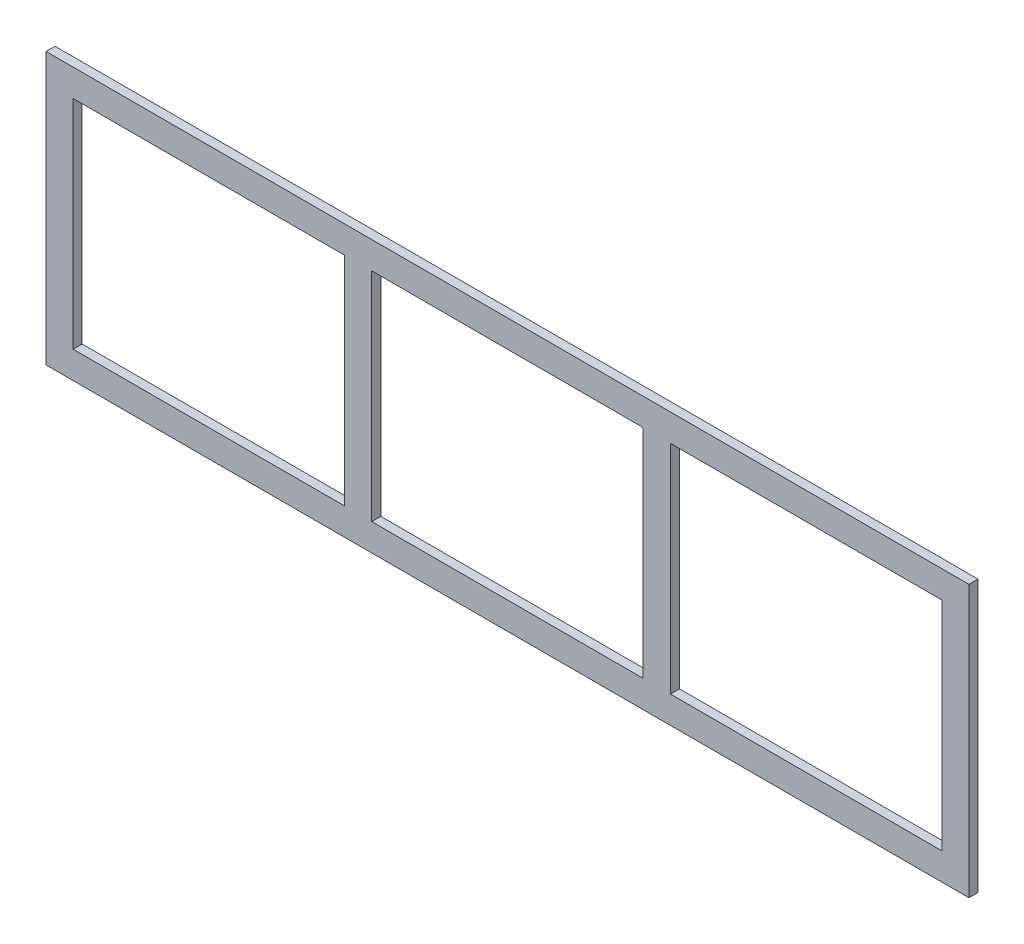
ISO-10303-21;
HEADER;
FILE_DESCRIPTION(('STEP AP214'),'2;1');
FILE_NAME('part.step','',(''),(''),'','','');
FILE_SCHEMA(('AUTOMOTIVE_DESIGN { 1 0 10303 214 1 1 1 1 }'));
ENDSEC;
DATA;
#1=APPLICATION_CONTEXT('core data for automotive mechanical design processes');
#2=APPLICATION_PROTOCOL_DEFINITION('international standard','automotive_design',2000,#1);
#3=PRODUCT_CONTEXT('',#1,'mechanical');
#4=PRODUCT('Part','Part','',(#3));
#5=PRODUCT_RELATED_PRODUCT_CATEGORY('part','',(#4));
#6=PRODUCT_DEFINITION_FORMATION('','',#4);
#7=PRODUCT_DEFINITION_CONTEXT('part definition',#1,'design');
#8=PRODUCT_DEFINITION('design','',#6,#7);
#9=PRODUCT_DEFINITION_SHAPE('','',#8);
#10=(LENGTH_UNIT() NAMED_UNIT(*) SI_UNIT(.MILLI.,.METRE.));
#11=(NAMED_UNIT(*) PLANE_ANGLE_UNIT() SI_UNIT($,.RADIAN.));
#12=(NAMED_UNIT(*) SI_UNIT($,.STERADIAN.) SOLID_ANGLE_UNIT());
#13=UNCERTAINTY_MEASURE_WITH_UNIT(LENGTH_MEASURE(1.E-05),#10,'distance_accuracy_value','');
#14=(GEOMETRIC_REPRESENTATION_CONTEXT(3) GLOBAL_UNCERTAINTY_ASSIGNED_CONTEXT((#13)) GLOBAL_UNIT_ASSIGNED_CONTEXT((#10,
#11,#12)) REPRESENTATION_CONTEXT('',''));
#15=CARTESIAN_POINT('',(0.,0.,0.));
#16=DIRECTION('',(0.,0.,1.));
#17=DIRECTION('',(1.,0.,0.));
#18=AXIS2_PLACEMENT_3D('',#15,#16,#17);
#19=CARTESIAN_POINT('',(0.,600.,50.));
#20=DIRECTION('',(0.,1.,0.));
#21=DIRECTION('',(0.,0.,1.));
#22=AXIS2_PLACEMENT_3D('',#19,#20,#21);
#23=PLANE('',#22);
#24=DIRECTION('',(1.,0.,0.));
#25=VECTOR('',#24,1.);
#26=CARTESIAN_POINT('',(0.,600.,0.));
#27=LINE('',#26,#25);
#28=CARTESIAN_POINT('',(-749.999999999999,600.,0.));
#29=VERTEX_POINT('',#28);
#30=CARTESIAN_POINT('',(750.000000000001,600.,0.));
#31=VERTEX_POINT('',#30);
#32=EDGE_CURVE('E215',#29,#31,#27,.T.);
#33=ORIENTED_EDGE('',*,*,#32,.T.);
#34=DIRECTION('',(0.,0.,-1.));
#35=VECTOR('',#34,1.);
#36=CARTESIAN_POINT('',(750.000000000001,600.,50.));
#37=LINE('',#36,#35);
#38=CARTESIAN_POINT('',(750.000000000001,600.,50.));
#39=VERTEX_POINT('',#38);
#40=EDGE_CURVE('E11',#39,#31,#37,.T.);
#41=ORIENTED_EDGE('',*,*,#40,.F.);
#42=DIRECTION('',(1.,0.,0.));
#43=VECTOR('',#42,1.);
#44=CARTESIAN_POINT('',(0.,600.,50.));
#45=LINE('',#44,#43);
#46=CARTESIAN_POINT('',(-749.999999999999,600.,50.));
#47=VERTEX_POINT('',#46);
#48=EDGE_CURVE('E162',#47,#39,#45,.T.);
#49=ORIENTED_EDGE('',*,*,#48,.F.);
#50=DIRECTION('',(0.,0.,-1.));
#51=VECTOR('',#50,1.);
#52=CARTESIAN_POINT('',(-749.999999999999,600.,50.));
#53=LINE('',#52,#51);
#54=EDGE_CURVE('E54',#47,#29,#53,.T.);
#55=ORIENTED_EDGE('',*,*,#54,.T.);
#56=EDGE_LOOP('',(#33,#41,#49,#55));
#57=FACE_BOUND('',#56,.T.);
#58=ADVANCED_FACE('F35',(#57),#23,.F.);
#59=CARTESIAN_POINT('',(750.000000000002,0.,50.));
#60=DIRECTION('',(1.,0.,0.));
#61=DIRECTION('',(0.,1.,0.));
#62=AXIS2_PLACEMENT_3D('',#59,#60,#61);
#63=PLANE('',#62);
#64=DIRECTION('',(0.,-1.,0.));
#65=VECTOR('',#64,1.);
#66=CARTESIAN_POINT('',(750.000000000002,0.,0.));
#67=LINE('',#66,#65);
#68=CARTESIAN_POINT('',(750.000000000002,-600.,0.));
#69=VERTEX_POINT('',#68);
#70=EDGE_CURVE('E168',#31,#69,#67,.T.);
#71=ORIENTED_EDGE('',*,*,#70,.T.);
#72=DIRECTION('',(0.,0.,-1.));
#73=VECTOR('',#72,1.);
#74=CARTESIAN_POINT('',(750.000000000002,-600.,50.));
#75=LINE('',#74,#73);
#76=CARTESIAN_POINT('',(750.000000000002,-600.,50.));
#77=VERTEX_POINT('',#76);
#78=EDGE_CURVE('E45',#77,#69,#75,.T.);
#79=ORIENTED_EDGE('',*,*,#78,.F.);
#80=DIRECTION('',(0.,-1.,0.));
#81=VECTOR('',#80,1.);
#82=CARTESIAN_POINT('',(750.000000000002,0.,50.));
#83=LINE('',#82,#81);
#84=EDGE_CURVE('E156',#39,#77,#83,.T.);
#85=ORIENTED_EDGE('',*,*,#84,.F.);
#86=ORIENTED_EDGE('',*,*,#40,.T.);
#87=EDGE_LOOP('',(#71,#79,#85,#86));
#88=FACE_BOUND('',#87,.T.);
#89=ADVANCED_FACE('F167',(#88),#63,.F.);
#90=CARTESIAN_POINT('',(0.,-600.,50.));
#91=DIRECTION('',(0.,1.,0.));
#92=DIRECTION('',(0.,0.,1.));
#93=AXIS2_PLACEMENT_3D('',#90,#91,#92);
#94=PLANE('',#93);
#95=DIRECTION('',(1.,0.,0.));
#96=VECTOR('',#95,1.);
#97=CARTESIAN_POINT('',(0.,-600.,0.));
#98=LINE('',#97,#96);
#99=CARTESIAN_POINT('',(-749.999999999998,-600.,0.));
#100=VERTEX_POINT('',#99);
#101=EDGE_CURVE('E218',#100,#69,#98,.T.);
#102=ORIENTED_EDGE('',*,*,#101,.F.);
#103=DIRECTION('',(0.,0.,-1.));
#104=VECTOR('',#103,1.);
#105=CARTESIAN_POINT('',(-749.999999999998,-600.,50.));
#106=LINE('',#105,#104);
#107=CARTESIAN_POINT('',(-749.999999999998,-600.,50.));
#108=VERTEX_POINT('',#107);
#109=EDGE_CURVE('E104',#108,#100,#106,.T.);
#110=ORIENTED_EDGE('',*,*,#109,.F.);
#111=DIRECTION('',(1.,0.,0.));
#112=VECTOR('',#111,1.);
#113=CARTESIAN_POINT('',(0.,-600.,50.));
#114=LINE('',#113,#112);
#115=EDGE_CURVE('E161',#108,#77,#114,.T.);
#116=ORIENTED_EDGE('',*,*,#115,.T.);
#117=ORIENTED_EDGE('',*,*,#78,.T.);
#118=EDGE_LOOP('',(#102,#110,#116,#117));
#119=FACE_BOUND('',#118,.T.);
#120=ADVANCED_FACE('F172',(#119),#94,.T.);
#121=CARTESIAN_POINT('',(0.,600.,50.));
#122=DIRECTION('',(0.,-1.,0.));
#123=DIRECTION('',(0.,0.,-1.));
#124=AXIS2_PLACEMENT_3D('',#121,#122,#123);
#125=PLANE('',#124);
#126=DIRECTION('',(-1.,0.,0.));
#127=VECTOR('',#126,1.);
#128=CARTESIAN_POINT('',(0.,600.,0.));
#129=LINE('',#128,#127);
#130=CARTESIAN_POINT('',(-899.999999999999,600.,0.));
#131=VERTEX_POINT('',#130);
#132=CARTESIAN_POINT('',(-2400.,600.,0.));
#133=VERTEX_POINT('',#132);
#134=EDGE_CURVE('E203',#131,#133,#129,.T.);
#135=ORIENTED_EDGE('',*,*,#134,.F.);
#136=DIRECTION('',(0.,0.,-1.));
#137=VECTOR('',#136,1.);
#138=CARTESIAN_POINT('',(-899.999999999999,600.,50.));
#139=LINE('',#138,#137);
#140=CARTESIAN_POINT('',(-899.999999999999,600.,50.));
#141=VERTEX_POINT('',#140);
#142=EDGE_CURVE('E225',#141,#131,#139,.T.);
#143=ORIENTED_EDGE('',*,*,#142,.F.);
#144=DIRECTION('',(-1.,0.,0.));
#145=VECTOR('',#144,1.);
#146=CARTESIAN_POINT('',(0.,600.,50.));
#147=LINE('',#146,#145);
#148=CARTESIAN_POINT('',(-2400.,600.,50.));
#149=VERTEX_POINT('',#148);
#150=EDGE_CURVE('E285',#141,#149,#147,.T.);
#151=ORIENTED_EDGE('',*,*,#150,.T.);
#152=DIRECTION('',(0.,0.,-1.));
#153=VECTOR('',#152,1.);
#154=CARTESIAN_POINT('',(-2400.,600.,50.));
#155=LINE('',#154,#153);
#156=EDGE_CURVE('E227',#149,#133,#155,.T.);
#157=ORIENTED_EDGE('',*,*,#156,.T.);
#158=EDGE_LOOP('',(#135,#143,#151,#157));
#159=FACE_BOUND('',#158,.T.);
#160=ADVANCED_FACE('F304',(#159),#125,.T.);
#161=CARTESIAN_POINT('',(-899.999999999999,0.,50.));
#162=DIRECTION('',(1.,0.,0.));
#163=DIRECTION('',(0.,1.,0.));
#164=AXIS2_PLACEMENT_3D('',#161,#162,#163);
#165=PLANE('',#164);
#166=DIRECTION('',(0.,-1.,0.));
#167=VECTOR('',#166,1.);
#168=CARTESIAN_POINT('',(-899.999999999999,0.,0.));
#169=LINE('',#168,#167);
#170=CARTESIAN_POINT('',(-899.999999999999,-600.,0.));
#171=VERTEX_POINT('',#170);
#172=EDGE_CURVE('E206',#131,#171,#169,.T.);
#173=ORIENTED_EDGE('',*,*,#172,.T.);
#174=DIRECTION('',(0.,0.,-1.));
#175=VECTOR('',#174,1.);
#176=CARTESIAN_POINT('',(-899.999999999999,-600.,50.));
#177=LINE('',#176,#175);
#178=CARTESIAN_POINT('',(-899.999999999999,-600.,50.));
#179=VERTEX_POINT('',#178);
#180=EDGE_CURVE('E232',#179,#171,#177,.T.);
#181=ORIENTED_EDGE('',*,*,#180,.F.);
#182=DIRECTION('',(0.,-1.,0.));
#183=VECTOR('',#182,1.);
#184=CARTESIAN_POINT('',(-899.999999999999,0.,50.));
#185=LINE('',#184,#183);
#186=EDGE_CURVE('E288',#141,#179,#185,.T.);
#187=ORIENTED_EDGE('',*,*,#186,.F.);
#188=ORIENTED_EDGE('',*,*,#142,.T.);
#189=EDGE_LOOP('',(#173,#181,#187,#188));
#190=FACE_BOUND('',#189,.T.);
#191=ADVANCED_FACE('F309',(#190),#165,.F.);
#192=CARTESIAN_POINT('',(0.,-600.,50.));
#193=DIRECTION('',(0.,1.,0.));
#194=DIRECTION('',(0.,0.,1.));
#195=AXIS2_PLACEMENT_3D('',#192,#193,#194);
#196=PLANE('',#195);
#197=DIRECTION('',(1.,0.,0.));
#198=VECTOR('',#197,1.);
#199=CARTESIAN_POINT('',(0.,-600.,0.));
#200=LINE('',#199,#198);
#201=CARTESIAN_POINT('',(-2400.,-600.,0.));
#202=VERTEX_POINT('',#201);
#203=EDGE_CURVE('E209',#202,#171,#200,.T.);
#204=ORIENTED_EDGE('',*,*,#203,.F.);
#205=DIRECTION('',(0.,0.,-1.));
#206=VECTOR('',#205,1.);
#207=CARTESIAN_POINT('',(-2400.,-600.,50.));
#208=LINE('',#207,#206);
#209=CARTESIAN_POINT('',(-2400.,-600.,50.));
#210=VERTEX_POINT('',#209);
#211=EDGE_CURVE('E229',#210,#202,#208,.T.);
#212=ORIENTED_EDGE('',*,*,#211,.F.);
#213=DIRECTION('',(1.,0.,0.));
#214=VECTOR('',#213,1.);
#215=CARTESIAN_POINT('',(0.,-600.,50.));
#216=LINE('',#215,#214);
#217=EDGE_CURVE('E290',#210,#179,#216,.T.);
#218=ORIENTED_EDGE('',*,*,#217,.T.);
#219=ORIENTED_EDGE('',*,*,#180,.T.);
#220=EDGE_LOOP('',(#204,#212,#218,#219));
#221=FACE_BOUND('',#220,.T.);
#222=ADVANCED_FACE('F312',(#221),#196,.T.);
#223=CARTESIAN_POINT('',(-2550.,0.,50.));
#224=DIRECTION('',(-1.,0.,0.));
#225=DIRECTION('',(0.,0.,1.));
#226=AXIS2_PLACEMENT_3D('',#223,#224,#225);
#227=PLANE('',#226);
#228=DIRECTION('',(0.,1.,0.));
#229=VECTOR('',#228,1.);
#230=CARTESIAN_POINT('',(-2550.,0.,0.));
#231=LINE('',#230,#229);
#232=CARTESIAN_POINT('',(-2550.,-750.,0.));
#233=VERTEX_POINT('',#232);
#234=CARTESIAN_POINT('',(-2550.,750.,0.));
#235=VERTEX_POINT('',#234);
#236=EDGE_CURVE('E191',#233,#235,#231,.T.);
#237=ORIENTED_EDGE('',*,*,#236,.F.);
#238=DIRECTION('',(0.,0.,-1.));
#239=VECTOR('',#238,1.);
#240=CARTESIAN_POINT('',(-2550.,-750.,50.));
#241=LINE('',#240,#239);
#242=CARTESIAN_POINT('',(-2550.,-750.,50.));
#243=VERTEX_POINT('',#242);
#244=EDGE_CURVE('E230',#243,#233,#241,.T.);
#245=ORIENTED_EDGE('',*,*,#244,.F.);
#246=DIRECTION('',(0.,1.,0.));
#247=VECTOR('',#246,1.);
#248=CARTESIAN_POINT('',(-2550.,0.,50.));
#249=LINE('',#248,#247);
#250=CARTESIAN_POINT('',(-2550.,750.,50.));
#251=VERTEX_POINT('',#250);
#252=EDGE_CURVE('E268',#243,#251,#249,.T.);
#253=ORIENTED_EDGE('',*,*,#252,.T.);
#254=DIRECTION('',(0.,0.,-1.));
#255=VECTOR('',#254,1.);
#256=CARTESIAN_POINT('',(-2550.,750.,50.));
#257=LINE('',#256,#255);
#258=EDGE_CURVE('E235',#251,#235,#257,.T.);
#259=ORIENTED_EDGE('',*,*,#258,.T.);
#260=EDGE_LOOP('',(#237,#245,#253,#259));
#261=FACE_BOUND('',#260,.T.);
#262=ADVANCED_FACE('F339',(#261),#227,.T.);
#263=CARTESIAN_POINT('',(0.,-750.,50.));
#264=DIRECTION('',(0.,-1.,0.));
#265=DIRECTION('',(1.,0.,0.));
#266=AXIS2_PLACEMENT_3D('',#263,#264,#265);
#267=PLANE('',#266);
#268=DIRECTION('',(-1.,0.,0.));
#269=VECTOR('',#268,1.);
#270=CARTESIAN_POINT('',(0.,-750.,0.));
#271=LINE('',#270,#269);
#272=CARTESIAN_POINT('',(2550.,-750.,0.));
#273=VERTEX_POINT('',#272);
#274=EDGE_CURVE('E194',#273,#233,#271,.T.);
#275=ORIENTED_EDGE('',*,*,#274,.F.);
#276=DIRECTION('',(0.,0.,-1.));
#277=VECTOR('',#276,1.);
#278=CARTESIAN_POINT('',(2550.,-750.,50.));
#279=LINE('',#278,#277);
#280=CARTESIAN_POINT('',(2550.,-750.,50.));
#281=VERTEX_POINT('',#280);
#282=EDGE_CURVE('E240',#281,#273,#279,.T.);
#283=ORIENTED_EDGE('',*,*,#282,.F.);
#284=DIRECTION('',(-1.,0.,0.));
#285=VECTOR('',#284,1.);
#286=CARTESIAN_POINT('',(0.,-750.,50.));
#287=LINE('',#286,#285);
#288=EDGE_CURVE('E277',#281,#243,#287,.T.);
#289=ORIENTED_EDGE('',*,*,#288,.T.);
#290=ORIENTED_EDGE('',*,*,#244,.T.);
#291=EDGE_LOOP('',(#275,#283,#289,#290));
#292=FACE_BOUND('',#291,.T.);
#293=ADVANCED_FACE('F350',(#292),#267,.T.);
#294=CARTESIAN_POINT('',(2550.,0.,50.));
#295=DIRECTION('',(-1.,0.,0.));
#296=DIRECTION('',(0.,0.,1.));
#297=AXIS2_PLACEMENT_3D('',#294,#295,#296);
#298=PLANE('',#297);
#299=DIRECTION('',(0.,1.,0.));
#300=VECTOR('',#299,1.);
#301=CARTESIAN_POINT('',(2550.,0.,0.));
#302=LINE('',#301,#300);
#303=CARTESIAN_POINT('',(2550.,750.,0.));
#304=VERTEX_POINT('',#303);
#305=EDGE_CURVE('E197',#273,#304,#302,.T.);
#306=ORIENTED_EDGE('',*,*,#305,.T.);
#307=DIRECTION('',(0.,0.,-1.));
#308=VECTOR('',#307,1.);
#309=CARTESIAN_POINT('',(2550.,750.,50.));
#310=LINE('',#309,#308);
#311=CARTESIAN_POINT('',(2550.,750.,50.));
#312=VERTEX_POINT('',#311);
#313=EDGE_CURVE('E237',#312,#304,#310,.T.);
#314=ORIENTED_EDGE('',*,*,#313,.F.);
#315=DIRECTION('',(0.,1.,0.));
#316=VECTOR('',#315,1.);
#317=CARTESIAN_POINT('',(2550.,0.,50.));
#318=LINE('',#317,#316);
#319=EDGE_CURVE('E280',#281,#312,#318,.T.);
#320=ORIENTED_EDGE('',*,*,#319,.F.);
#321=ORIENTED_EDGE('',*,*,#282,.T.);
#322=EDGE_LOOP('',(#306,#314,#320,#321));
#323=FACE_BOUND('',#322,.T.);
#324=ADVANCED_FACE('F347',(#323),#298,.F.);
#325=CARTESIAN_POINT('',(900.000000000001,0.,50.));
#326=DIRECTION('',(1.,0.,0.));
#327=DIRECTION('',(0.,1.,0.));
#328=AXIS2_PLACEMENT_3D('',#325,#326,#327);
#329=PLANE('',#328);
#330=DIRECTION('',(0.,-1.,0.));
#331=VECTOR('',#330,1.);
#332=CARTESIAN_POINT('',(900.000000000001,0.,0.));
#333=LINE('',#332,#331);
#334=CARTESIAN_POINT('',(900.000000000001,600.,0.));
#335=VERTEX_POINT('',#334);
#336=CARTESIAN_POINT('',(900.000000000002,-600.,0.));
#337=VERTEX_POINT('',#336);
#338=EDGE_CURVE('E179',#335,#337,#333,.T.);
#339=ORIENTED_EDGE('',*,*,#338,.F.);
#340=DIRECTION('',(0.,0.,-1.));
#341=VECTOR('',#340,1.);
#342=CARTESIAN_POINT('',(900.000000000001,600.,50.));
#343=LINE('',#342,#341);
#344=CARTESIAN_POINT('',(900.000000000001,600.,50.));
#345=VERTEX_POINT('',#344);
#346=EDGE_CURVE('E39',#345,#335,#343,.T.);
#347=ORIENTED_EDGE('',*,*,#346,.F.);
#348=DIRECTION('',(0.,-1.,0.));
#349=VECTOR('',#348,1.);
#350=CARTESIAN_POINT('',(900.000000000001,0.,50.));
#351=LINE('',#350,#349);
#352=CARTESIAN_POINT('',(900.000000000002,-600.,50.));
#353=VERTEX_POINT('',#352);
#354=EDGE_CURVE('E223',#345,#353,#351,.T.);
#355=ORIENTED_EDGE('',*,*,#354,.T.);
#356=DIRECTION('',(0.,0.,-1.));
#357=VECTOR('',#356,1.);
#358=CARTESIAN_POINT('',(900.000000000002,-600.,50.));
#359=LINE('',#358,#357);
#360=EDGE_CURVE('E175',#353,#337,#359,.T.);
#361=ORIENTED_EDGE('',*,*,#360,.T.);
#362=EDGE_LOOP('',(#339,#347,#355,#361));
#363=FACE_BOUND('',#362,.T.);
#364=ADVANCED_FACE('F37',(#363),#329,.T.);
#365=CARTESIAN_POINT('',(0.,600.,50.));
#366=DIRECTION('',(0.,-1.,0.));
#367=DIRECTION('',(0.,0.,-1.));
#368=AXIS2_PLACEMENT_3D('',#365,#366,#367);
#369=PLANE('',#368);
#370=DIRECTION('',(-1.,0.,0.));
#371=VECTOR('',#370,1.);
#372=CARTESIAN_POINT('',(0.,600.,0.));
#373=LINE('',#372,#371);
#374=CARTESIAN_POINT('',(2400.,600.,0.));
#375=VERTEX_POINT('',#374);
#376=EDGE_CURVE('E182',#375,#335,#373,.T.);
#377=ORIENTED_EDGE('',*,*,#376,.F.);
#378=DIRECTION('',(0.,0.,-1.));
#379=VECTOR('',#378,1.);
#380=CARTESIAN_POINT('',(2400.,600.,50.));
#381=LINE('',#380,#379);
#382=CARTESIAN_POINT('',(2400.,600.,50.));
#383=VERTEX_POINT('',#382);
#384=EDGE_CURVE('E245',#383,#375,#381,.T.);
#385=ORIENTED_EDGE('',*,*,#384,.F.);
#386=DIRECTION('',(-1.,0.,0.));
#387=VECTOR('',#386,1.);
#388=CARTESIAN_POINT('',(0.,600.,50.));
#389=LINE('',#388,#387);
#390=EDGE_CURVE('E254',#383,#345,#389,.T.);
#391=ORIENTED_EDGE('',*,*,#390,.T.);
#392=ORIENTED_EDGE('',*,*,#346,.T.);
#393=EDGE_LOOP('',(#377,#385,#391,#392));
#394=FACE_BOUND('',#393,.T.);
#395=ADVANCED_FACE('F252',(#394),#369,.T.);
#396=CARTESIAN_POINT('',(2400.,0.,50.));
#397=DIRECTION('',(-1.,0.,0.));
#398=DIRECTION('',(0.,0.,1.));
#399=AXIS2_PLACEMENT_3D('',#396,#397,#398);
#400=PLANE('',#399);
#401=DIRECTION('',(0.,1.,0.));
#402=VECTOR('',#401,1.);
#403=CARTESIAN_POINT('',(2400.,0.,0.));
#404=LINE('',#403,#402);
#405=CARTESIAN_POINT('',(2400.,-600.,0.));
#406=VERTEX_POINT('',#405);
#407=EDGE_CURVE('E185',#406,#375,#404,.T.);
#408=ORIENTED_EDGE('',*,*,#407,.F.);
#409=DIRECTION('',(0.,0.,-1.));
#410=VECTOR('',#409,1.);
#411=CARTESIAN_POINT('',(2400.,-600.,50.));
#412=LINE('',#411,#410);
#413=CARTESIAN_POINT('',(2400.,-600.,50.));
#414=VERTEX_POINT('',#413);
#415=EDGE_CURVE('E244',#414,#406,#412,.T.);
#416=ORIENTED_EDGE('',*,*,#415,.F.);
#417=DIRECTION('',(0.,1.,0.));
#418=VECTOR('',#417,1.);
#419=CARTESIAN_POINT('',(2400.,0.,50.));
#420=LINE('',#419,#418);
#421=EDGE_CURVE('E263',#414,#383,#420,.T.);
#422=ORIENTED_EDGE('',*,*,#421,.T.);
#423=ORIENTED_EDGE('',*,*,#384,.T.);
#424=EDGE_LOOP('',(#408,#416,#422,#423));
#425=FACE_BOUND('',#424,.T.);
#426=ADVANCED_FACE('F260',(#425),#400,.T.);
#427=CARTESIAN_POINT('',(-2400.,0.,50.));
#428=DIRECTION('',(-1.,0.,0.));
#429=DIRECTION('',(0.,0.,1.));
#430=AXIS2_PLACEMENT_3D('',#427,#428,#429);
#431=PLANE('',#430);
#432=DIRECTION('',(0.,1.,0.));
#433=VECTOR('',#432,1.);
#434=CARTESIAN_POINT('',(-2400.,0.,0.));
#435=LINE('',#434,#433);
#436=EDGE_CURVE('E212',#202,#133,#435,.T.);
#437=ORIENTED_EDGE('',*,*,#436,.T.);
#438=ORIENTED_EDGE('',*,*,#156,.F.);
#439=DIRECTION('',(0.,1.,0.));
#440=VECTOR('',#439,1.);
#441=CARTESIAN_POINT('',(-2400.,0.,50.));
#442=LINE('',#441,#440);
#443=EDGE_CURVE('E293',#210,#149,#442,.T.);
#444=ORIENTED_EDGE('',*,*,#443,.F.);
#445=ORIENTED_EDGE('',*,*,#211,.T.);
#446=EDGE_LOOP('',(#437,#438,#444,#445));
#447=FACE_BOUND('',#446,.T.);
#448=ADVANCED_FACE('F300',(#447),#431,.F.);
#449=CARTESIAN_POINT('',(0.,750.,50.));
#450=DIRECTION('',(0.,-1.,0.));
#451=DIRECTION('',(1.,0.,0.));
#452=AXIS2_PLACEMENT_3D('',#449,#450,#451);
#453=PLANE('',#452);
#454=DIRECTION('',(-1.,0.,0.));
#455=VECTOR('',#454,1.);
#456=CARTESIAN_POINT('',(0.,750.,0.));
#457=LINE('',#456,#455);
#458=EDGE_CURVE('E200',#304,#235,#457,.T.);
#459=ORIENTED_EDGE('',*,*,#458,.T.);
#460=ORIENTED_EDGE('',*,*,#258,.F.);
#461=DIRECTION('',(-1.,0.,0.));
#462=VECTOR('',#461,1.);
#463=CARTESIAN_POINT('',(0.,750.,50.));
#464=LINE('',#463,#462);
#465=EDGE_CURVE('E283',#312,#251,#464,.T.);
#466=ORIENTED_EDGE('',*,*,#465,.F.);
#467=ORIENTED_EDGE('',*,*,#313,.T.);
#468=EDGE_LOOP('',(#459,#460,#466,#467));
#469=FACE_BOUND('',#468,.T.);
#470=ADVANCED_FACE('F325',(#469),#453,.F.);
#471=CARTESIAN_POINT('',(0.,-600.,50.));
#472=DIRECTION('',(0.,-1.,0.));
#473=DIRECTION('',(0.,0.,-1.));
#474=AXIS2_PLACEMENT_3D('',#471,#472,#473);
#475=PLANE('',#474);
#476=DIRECTION('',(-1.,0.,0.));
#477=VECTOR('',#476,1.);
#478=CARTESIAN_POINT('',(0.,-600.,0.));
#479=LINE('',#478,#477);
#480=EDGE_CURVE('E188',#406,#337,#479,.T.);
#481=ORIENTED_EDGE('',*,*,#480,.T.);
#482=ORIENTED_EDGE('',*,*,#360,.F.);
#483=DIRECTION('',(-1.,0.,0.));
#484=VECTOR('',#483,1.);
#485=CARTESIAN_POINT('',(0.,-600.,50.));
#486=LINE('',#485,#484);
#487=EDGE_CURVE('E265',#414,#353,#486,.T.);
#488=ORIENTED_EDGE('',*,*,#487,.F.);
#489=ORIENTED_EDGE('',*,*,#415,.T.);
#490=EDGE_LOOP('',(#481,#482,#488,#489));
#491=FACE_BOUND('',#490,.T.);
#492=ADVANCED_FACE('F266',(#491),#475,.F.);
#493=CARTESIAN_POINT('',(-749.999999999998,0.,50.));
#494=DIRECTION('',(1.,0.,0.));
#495=DIRECTION('',(0.,1.,0.));
#496=AXIS2_PLACEMENT_3D('',#493,#494,#495);
#497=PLANE('',#496);
#498=DIRECTION('',(0.,-1.,0.));
#499=VECTOR('',#498,1.);
#500=CARTESIAN_POINT('',(-749.999999999998,0.,0.));
#501=LINE('',#500,#499);
#502=EDGE_CURVE('E220',#29,#100,#501,.T.);
#503=ORIENTED_EDGE('',*,*,#502,.F.);
#504=ORIENTED_EDGE('',*,*,#54,.F.);
#505=DIRECTION('',(0.,-1.,0.));
#506=VECTOR('',#505,1.);
#507=CARTESIAN_POINT('',(-749.999999999998,0.,50.));
#508=LINE('',#507,#506);
#509=EDGE_CURVE('E173',#47,#108,#508,.T.);
#510=ORIENTED_EDGE('',*,*,#509,.T.);
#511=ORIENTED_EDGE('',*,*,#109,.T.);
#512=EDGE_LOOP('',(#503,#504,#510,#511));
#513=FACE_BOUND('',#512,.T.);
#514=ADVANCED_FACE('F317',(#513),#497,.T.);
#515=CARTESIAN_POINT('',(0.,0.,50.));
#516=DIRECTION('',(0.,0.,1.));
#517=DIRECTION('',(1.,0.,0.));
#518=AXIS2_PLACEMENT_3D('',#515,#516,#517);
#519=PLANE('',#518);
#520=ORIENTED_EDGE('',*,*,#354,.F.);
#521=ORIENTED_EDGE('',*,*,#390,.F.);
#522=ORIENTED_EDGE('',*,*,#421,.F.);
#523=ORIENTED_EDGE('',*,*,#487,.T.);
#524=EDGE_LOOP('',(#520,#521,#522,#523));
#525=FACE_BOUND('',#524,.T.);
#526=ORIENTED_EDGE('',*,*,#252,.F.);
#527=ORIENTED_EDGE('',*,*,#288,.F.);
#528=ORIENTED_EDGE('',*,*,#319,.T.);
#529=ORIENTED_EDGE('',*,*,#465,.T.);
#530=EDGE_LOOP('',(#526,#527,#528,#529));
#531=FACE_BOUND('',#530,.T.);
#532=ORIENTED_EDGE('',*,*,#150,.F.);
#533=ORIENTED_EDGE('',*,*,#186,.T.);
#534=ORIENTED_EDGE('',*,*,#217,.F.);
#535=ORIENTED_EDGE('',*,*,#443,.T.);
#536=EDGE_LOOP('',(#532,#533,#534,#535));
#537=FACE_BOUND('',#536,.T.);
#538=ORIENTED_EDGE('',*,*,#48,.T.);
#539=ORIENTED_EDGE('',*,*,#84,.T.);
#540=ORIENTED_EDGE('',*,*,#115,.F.);
#541=ORIENTED_EDGE('',*,*,#509,.F.);
#542=EDGE_LOOP('',(#538,#539,#540,#541));
#543=FACE_BOUND('',#542,.T.);
#544=ADVANCED_FACE('F158',(#525,#531,#537,#543),#519,.T.);
#545=CARTESIAN_POINT('',(0.,0.,0.));
#546=DIRECTION('',(0.,0.,1.));
#547=DIRECTION('',(1.,0.,0.));
#548=AXIS2_PLACEMENT_3D('',#545,#546,#547);
#549=PLANE('',#548);
#550=ORIENTED_EDGE('',*,*,#338,.T.);
#551=ORIENTED_EDGE('',*,*,#480,.F.);
#552=ORIENTED_EDGE('',*,*,#407,.T.);
#553=ORIENTED_EDGE('',*,*,#376,.T.);
#554=EDGE_LOOP('',(#550,#551,#552,#553));
#555=FACE_BOUND('',#554,.T.);
#556=ORIENTED_EDGE('',*,*,#236,.T.);
#557=ORIENTED_EDGE('',*,*,#458,.F.);
#558=ORIENTED_EDGE('',*,*,#305,.F.);
#559=ORIENTED_EDGE('',*,*,#274,.T.);
#560=EDGE_LOOP('',(#556,#557,#558,#559));
#561=FACE_BOUND('',#560,.T.);
#562=ORIENTED_EDGE('',*,*,#134,.T.);
#563=ORIENTED_EDGE('',*,*,#436,.F.);
#564=ORIENTED_EDGE('',*,*,#203,.T.);
#565=ORIENTED_EDGE('',*,*,#172,.F.);
#566=EDGE_LOOP('',(#562,#563,#564,#565));
#567=FACE_BOUND('',#566,.T.);
#568=ORIENTED_EDGE('',*,*,#32,.F.);
#569=ORIENTED_EDGE('',*,*,#502,.T.);
#570=ORIENTED_EDGE('',*,*,#101,.T.);
#571=ORIENTED_EDGE('',*,*,#70,.F.);
#572=EDGE_LOOP('',(#568,#569,#570,#571));
#573=FACE_BOUND('',#572,.T.);
#574=ADVANCED_FACE('F258',(#555,#561,#567,#573),#549,.F.);
#575=CLOSED_SHELL('',(#58,#89,#120,#160,#191,#222,#262,#293,#324,#364,#395,#426,#448,#470,#492,
#514,#544,#574));
#576=MANIFOLD_SOLID_BREP('B2',#575);
#577=ADVANCED_BREP_SHAPE_REPRESENTATION('',(#18,#576),#14);
#578=SHAPE_DEFINITION_REPRESENTATION(#9,#577);
ENDSEC;
END-ISO-10303-21;
